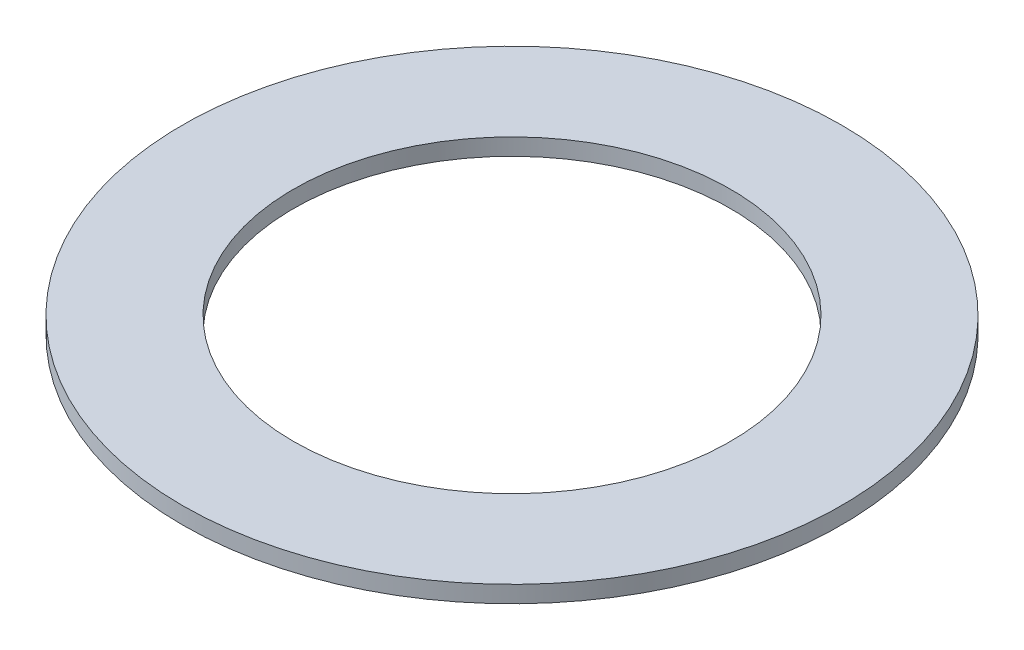
ISO-10303-21;
HEADER;
FILE_DESCRIPTION(('STEP AP214'),'2;1');
FILE_NAME('part.step','',(''),(''),'','','');
FILE_SCHEMA(('AUTOMOTIVE_DESIGN { 1 0 10303 214 1 1 1 1 }'));
ENDSEC;
DATA;
#1=APPLICATION_CONTEXT('core data for automotive mechanical design processes');
#2=APPLICATION_PROTOCOL_DEFINITION('international standard','automotive_design',2000,#1);
#3=PRODUCT_CONTEXT('',#1,'mechanical');
#4=PRODUCT('Part','Part','',(#3));
#5=PRODUCT_RELATED_PRODUCT_CATEGORY('part','',(#4));
#6=PRODUCT_DEFINITION_FORMATION('','',#4);
#7=PRODUCT_DEFINITION_CONTEXT('part definition',#1,'design');
#8=PRODUCT_DEFINITION('design','',#6,#7);
#9=PRODUCT_DEFINITION_SHAPE('','',#8);
#10=(LENGTH_UNIT() NAMED_UNIT(*) SI_UNIT(.MILLI.,.METRE.));
#11=(NAMED_UNIT(*) PLANE_ANGLE_UNIT() SI_UNIT($,.RADIAN.));
#12=(NAMED_UNIT(*) SI_UNIT($,.STERADIAN.) SOLID_ANGLE_UNIT());
#13=UNCERTAINTY_MEASURE_WITH_UNIT(LENGTH_MEASURE(1.E-05),#10,'distance_accuracy_value','');
#14=(GEOMETRIC_REPRESENTATION_CONTEXT(3) GLOBAL_UNCERTAINTY_ASSIGNED_CONTEXT((#13)) GLOBAL_UNIT_ASSIGNED_CONTEXT((#10,
#11,#12)) REPRESENTATION_CONTEXT('',''));
#15=CARTESIAN_POINT('',(0.,0.,0.));
#16=DIRECTION('',(0.,0.,1.));
#17=DIRECTION('',(1.,0.,0.));
#18=AXIS2_PLACEMENT_3D('',#15,#16,#17);
#19=CARTESIAN_POINT('',(0.,-2.,0.));
#20=DIRECTION('',(0.,1.,0.));
#21=DIRECTION('',(0.,0.,1.));
#22=AXIS2_PLACEMENT_3D('',#19,#20,#21);
#23=CYLINDRICAL_SURFACE('',#22,78.35);
#24=CARTESIAN_POINT('',(0.,-2.,0.));
#25=DIRECTION('',(0.,1.,0.));
#26=DIRECTION('',(0.,0.,1.));
#27=AXIS2_PLACEMENT_3D('',#24,#25,#26);
#28=CIRCLE('',#27,78.35);
#29=CARTESIAN_POINT('',(0.,-2.,78.35));
#30=VERTEX_POINT('',#29);
#31=EDGE_CURVE('E10',#30,#30,#28,.T.);
#32=ORIENTED_EDGE('',*,*,#31,.T.);
#33=EDGE_LOOP('',(#32));
#34=FACE_BOUND('',#33,.T.);
#35=CARTESIAN_POINT('',(0.,2.,0.));
#36=DIRECTION('',(0.,1.,0.));
#37=DIRECTION('',(0.,0.,1.));
#38=AXIS2_PLACEMENT_3D('',#35,#36,#37);
#39=CIRCLE('',#38,78.35);
#40=CARTESIAN_POINT('',(0.,2.,78.35));
#41=VERTEX_POINT('',#40);
#42=EDGE_CURVE('E51',#41,#41,#39,.T.);
#43=ORIENTED_EDGE('',*,*,#42,.F.);
#44=EDGE_LOOP('',(#43));
#45=FACE_BOUND('',#44,.T.);
#46=ADVANCED_FACE('F39',(#34,#45),#23,.T.);
#47=CARTESIAN_POINT('',(0.,-2.,0.));
#48=DIRECTION('',(0.,1.,0.));
#49=DIRECTION('',(0.,0.,1.));
#50=AXIS2_PLACEMENT_3D('',#47,#48,#49);
#51=PLANE('',#50);
#52=CARTESIAN_POINT('',(0.,-2.,0.));
#53=DIRECTION('',(0.,1.,0.));
#54=DIRECTION('',(0.,0.,1.));
#55=AXIS2_PLACEMENT_3D('',#52,#53,#54);
#56=CIRCLE('',#55,51.95);
#57=CARTESIAN_POINT('',(0.,-2.,51.95));
#58=VERTEX_POINT('',#57);
#59=EDGE_CURVE('E46',#58,#58,#56,.T.);
#60=ORIENTED_EDGE('',*,*,#59,.T.);
#61=EDGE_LOOP('',(#60));
#62=FACE_BOUND('',#61,.T.);
#63=ORIENTED_EDGE('',*,*,#31,.F.);
#64=EDGE_LOOP('',(#63));
#65=FACE_BOUND('',#64,.T.);
#66=ADVANCED_FACE('F72',(#62,#65),#51,.F.);
#67=CARTESIAN_POINT('',(0.,-2.,0.));
#68=DIRECTION('',(0.,1.,0.));
#69=DIRECTION('',(0.,0.,1.));
#70=AXIS2_PLACEMENT_3D('',#67,#68,#69);
#71=CYLINDRICAL_SURFACE('',#70,51.95);
#72=ORIENTED_EDGE('',*,*,#59,.F.);
#73=EDGE_LOOP('',(#72));
#74=FACE_BOUND('',#73,.T.);
#75=CARTESIAN_POINT('',(0.,2.,0.));
#76=DIRECTION('',(0.,1.,0.));
#77=DIRECTION('',(0.,0.,1.));
#78=AXIS2_PLACEMENT_3D('',#75,#76,#77);
#79=CIRCLE('',#78,51.95);
#80=CARTESIAN_POINT('',(0.,2.,51.95));
#81=VERTEX_POINT('',#80);
#82=EDGE_CURVE('E56',#81,#81,#79,.T.);
#83=ORIENTED_EDGE('',*,*,#82,.T.);
#84=EDGE_LOOP('',(#83));
#85=FACE_BOUND('',#84,.T.);
#86=ADVANCED_FACE('F63',(#74,#85),#71,.F.);
#87=CARTESIAN_POINT('',(0.,2.,0.));
#88=DIRECTION('',(0.,1.,0.));
#89=DIRECTION('',(0.,0.,1.));
#90=AXIS2_PLACEMENT_3D('',#87,#88,#89);
#91=PLANE('',#90);
#92=ORIENTED_EDGE('',*,*,#42,.T.);
#93=EDGE_LOOP('',(#92));
#94=FACE_BOUND('',#93,.T.);
#95=ORIENTED_EDGE('',*,*,#82,.F.);
#96=EDGE_LOOP('',(#95));
#97=FACE_BOUND('',#96,.T.);
#98=ADVANCED_FACE('F65',(#94,#97),#91,.T.);
#99=CLOSED_SHELL('',(#46,#66,#86,#98));
#100=MANIFOLD_SOLID_BREP('B2',#99);
#101=ADVANCED_BREP_SHAPE_REPRESENTATION('',(#18,#100),#14);
#102=SHAPE_DEFINITION_REPRESENTATION(#9,#101);
ENDSEC;
END-ISO-10303-21;
